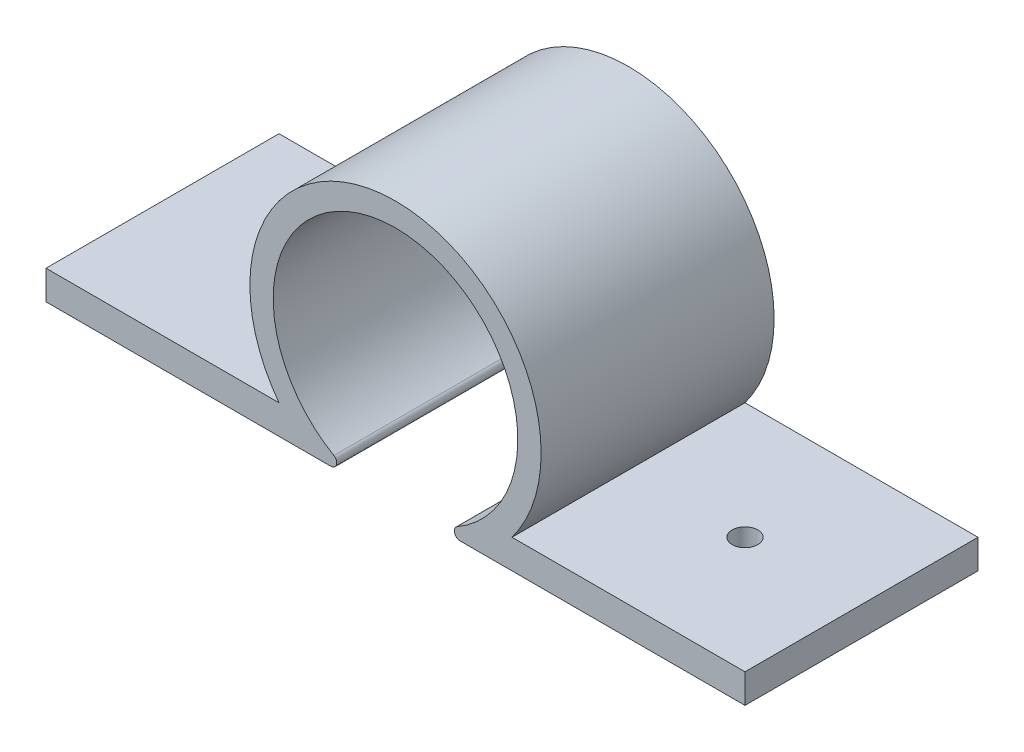
ISO-10303-21;
HEADER;
FILE_DESCRIPTION(('STEP AP214'),'2;1');
FILE_NAME('part.step','',(''),(''),'','','');
FILE_SCHEMA(('AUTOMOTIVE_DESIGN { 1 0 10303 214 1 1 1 1 }'));
ENDSEC;
DATA;
#1=APPLICATION_CONTEXT('core data for automotive mechanical design processes');
#2=APPLICATION_PROTOCOL_DEFINITION('international standard','automotive_design',2000,#1);
#3=PRODUCT_CONTEXT('',#1,'mechanical');
#4=PRODUCT('Part','Part','',(#3));
#5=PRODUCT_RELATED_PRODUCT_CATEGORY('part','',(#4));
#6=PRODUCT_DEFINITION_FORMATION('','',#4);
#7=PRODUCT_DEFINITION_CONTEXT('part definition',#1,'design');
#8=PRODUCT_DEFINITION('design','',#6,#7);
#9=PRODUCT_DEFINITION_SHAPE('','',#8);
#10=(LENGTH_UNIT() NAMED_UNIT(*) SI_UNIT(.MILLI.,.METRE.));
#11=(NAMED_UNIT(*) PLANE_ANGLE_UNIT() SI_UNIT($,.RADIAN.));
#12=(NAMED_UNIT(*) SI_UNIT($,.STERADIAN.) SOLID_ANGLE_UNIT());
#13=UNCERTAINTY_MEASURE_WITH_UNIT(LENGTH_MEASURE(1.E-05),#10,'distance_accuracy_value','');
#14=(GEOMETRIC_REPRESENTATION_CONTEXT(3) GLOBAL_UNCERTAINTY_ASSIGNED_CONTEXT((#13)) GLOBAL_UNIT_ASSIGNED_CONTEXT((#10,
#11,#12)) REPRESENTATION_CONTEXT('',''));
#15=CARTESIAN_POINT('',(0.,0.,0.));
#16=DIRECTION('',(0.,0.,1.));
#17=DIRECTION('',(1.,0.,0.));
#18=AXIS2_PLACEMENT_3D('',#15,#16,#17);
#19=CARTESIAN_POINT('',(-30.,-1.25,20.));
#20=DIRECTION('',(0.,1.,0.));
#21=DIRECTION('',(-1.,0.,0.));
#22=AXIS2_PLACEMENT_3D('',#19,#20,#21);
#23=PLANE('',#22);
#24=CARTESIAN_POINT('',(-20.,-1.25,10.));
#25=DIRECTION('',(0.,1.,0.));
#26=DIRECTION('',(-1.,0.,0.));
#27=AXIS2_PLACEMENT_3D('',#24,#25,#26);
#28=CIRCLE('',#27,1.1);
#29=CARTESIAN_POINT('',(-21.1,-1.25,10.));
#30=VERTEX_POINT('',#29);
#31=EDGE_CURVE('E214',#30,#30,#28,.F.);
#32=ORIENTED_EDGE('',*,*,#31,.F.);
#33=EDGE_LOOP('',(#32));
#34=FACE_BOUND('',#33,.T.);
#35=DIRECTION('',(1.,0.,0.));
#36=VECTOR('',#35,1.);
#37=CARTESIAN_POINT('',(-30.,-1.25,0.));
#38=LINE('',#37,#36);
#39=CARTESIAN_POINT('',(-30.,-1.25,0.));
#40=VERTEX_POINT('',#39);
#41=CARTESIAN_POINT('',(-5.54526825320472,-1.25,0.));
#42=VERTEX_POINT('',#41);
#43=EDGE_CURVE('E132',#40,#42,#38,.T.);
#44=ORIENTED_EDGE('',*,*,#43,.T.);
#45=DIRECTION('',(0.,0.,1.));
#46=VECTOR('',#45,1.);
#47=CARTESIAN_POINT('',(-5.54526825320471,-1.25,20.));
#48=LINE('',#47,#46);
#49=CARTESIAN_POINT('',(-5.54526825320472,-1.25,20.));
#50=VERTEX_POINT('',#49);
#51=EDGE_CURVE('E11',#42,#50,#48,.T.);
#52=ORIENTED_EDGE('',*,*,#51,.T.);
#53=DIRECTION('',(1.,0.,0.));
#54=VECTOR('',#53,1.);
#55=CARTESIAN_POINT('',(-30.,-1.25,20.));
#56=LINE('',#55,#54);
#57=CARTESIAN_POINT('',(-30.,-1.25,20.));
#58=VERTEX_POINT('',#57);
#59=EDGE_CURVE('E165',#58,#50,#56,.T.);
#60=ORIENTED_EDGE('',*,*,#59,.F.);
#61=DIRECTION('',(0.,0.,-1.));
#62=VECTOR('',#61,1.);
#63=CARTESIAN_POINT('',(-30.,-1.25,20.));
#64=LINE('',#63,#62);
#65=EDGE_CURVE('E183',#58,#40,#64,.T.);
#66=ORIENTED_EDGE('',*,*,#65,.T.);
#67=EDGE_LOOP('',(#44,#52,#60,#66));
#68=FACE_BOUND('',#67,.T.);
#69=ADVANCED_FACE('F36',(#34,#68),#23,.F.);
#70=CARTESIAN_POINT('',(30.,1.25,20.));
#71=DIRECTION('',(-1.,0.,0.));
#72=DIRECTION('',(0.,0.,1.));
#73=AXIS2_PLACEMENT_3D('',#70,#71,#72);
#74=PLANE('',#73);
#75=DIRECTION('',(0.,1.,0.));
#76=VECTOR('',#75,1.);
#77=CARTESIAN_POINT('',(30.,1.25,0.));
#78=LINE('',#77,#76);
#79=CARTESIAN_POINT('',(30.,-1.25,0.));
#80=VERTEX_POINT('',#79);
#81=CARTESIAN_POINT('',(30.,1.25,0.));
#82=VERTEX_POINT('',#81);
#83=EDGE_CURVE('E136',#80,#82,#78,.T.);
#84=ORIENTED_EDGE('',*,*,#83,.T.);
#85=DIRECTION('',(0.,0.,-1.));
#86=VECTOR('',#85,1.);
#87=CARTESIAN_POINT('',(30.,1.25,20.));
#88=LINE('',#87,#86);
#89=CARTESIAN_POINT('',(30.,1.25,20.));
#90=VERTEX_POINT('',#89);
#91=EDGE_CURVE('E117',#90,#82,#88,.T.);
#92=ORIENTED_EDGE('',*,*,#91,.F.);
#93=DIRECTION('',(0.,1.,0.));
#94=VECTOR('',#93,1.);
#95=CARTESIAN_POINT('',(30.,1.25,20.));
#96=LINE('',#95,#94);
#97=CARTESIAN_POINT('',(30.,-1.25,20.));
#98=VERTEX_POINT('',#97);
#99=EDGE_CURVE('E123',#98,#90,#96,.T.);
#100=ORIENTED_EDGE('',*,*,#99,.F.);
#101=DIRECTION('',(0.,0.,-1.));
#102=VECTOR('',#101,1.);
#103=CARTESIAN_POINT('',(30.,-1.25,20.));
#104=LINE('',#103,#102);
#105=EDGE_CURVE('E164',#98,#80,#104,.T.);
#106=ORIENTED_EDGE('',*,*,#105,.T.);
#107=EDGE_LOOP('',(#84,#92,#100,#106));
#108=FACE_BOUND('',#107,.T.);
#109=ADVANCED_FACE('F134',(#108),#74,.F.);
#110=CARTESIAN_POINT('',(10.,1.25000000000001,20.));
#111=DIRECTION('',(0.,-1.,0.));
#112=DIRECTION('',(1.,0.,0.));
#113=AXIS2_PLACEMENT_3D('',#110,#111,#112);
#114=PLANE('',#113);
#115=CARTESIAN_POINT('',(20.,1.25000000000001,10.));
#116=DIRECTION('',(0.,1.,0.));
#117=DIRECTION('',(0.,0.,1.));
#118=AXIS2_PLACEMENT_3D('',#115,#116,#117);
#119=CIRCLE('',#118,1.1);
#120=CARTESIAN_POINT('',(20.,1.25000000000001,11.1));
#121=VERTEX_POINT('',#120);
#122=EDGE_CURVE('E219',#121,#121,#119,.T.);
#123=ORIENTED_EDGE('',*,*,#122,.F.);
#124=EDGE_LOOP('',(#123));
#125=FACE_BOUND('',#124,.T.);
#126=DIRECTION('',(-1.,0.,0.));
#127=VECTOR('',#126,1.);
#128=CARTESIAN_POINT('',(10.,1.25000000000001,0.));
#129=LINE('',#128,#127);
#130=CARTESIAN_POINT('',(10.,1.25000000000001,0.));
#131=VERTEX_POINT('',#130);
#132=EDGE_CURVE('E205',#82,#131,#129,.T.);
#133=ORIENTED_EDGE('',*,*,#132,.T.);
#134=DIRECTION('',(0.,0.,-1.));
#135=VECTOR('',#134,1.);
#136=CARTESIAN_POINT('',(10.,1.25000000000001,20.));
#137=LINE('',#136,#135);
#138=CARTESIAN_POINT('',(10.,1.25000000000001,20.));
#139=VERTEX_POINT('',#138);
#140=EDGE_CURVE('E120',#139,#131,#137,.T.);
#141=ORIENTED_EDGE('',*,*,#140,.F.);
#142=DIRECTION('',(-1.,0.,0.));
#143=VECTOR('',#142,1.);
#144=CARTESIAN_POINT('',(10.,1.25000000000001,20.));
#145=LINE('',#144,#143);
#146=EDGE_CURVE('E113',#90,#139,#145,.T.);
#147=ORIENTED_EDGE('',*,*,#146,.F.);
#148=ORIENTED_EDGE('',*,*,#91,.T.);
#149=EDGE_LOOP('',(#133,#141,#147,#148));
#150=FACE_BOUND('',#149,.T.);
#151=ADVANCED_FACE('F115',(#125,#150),#114,.F.);
#152=CARTESIAN_POINT('',(0.,8.75,20.));
#153=DIRECTION('',(0.,0.,-1.));
#154=DIRECTION('',(-1.,0.,0.));
#155=AXIS2_PLACEMENT_3D('',#152,#153,#154);
#156=CYLINDRICAL_SURFACE('',#155,12.5);
#157=CARTESIAN_POINT('',(0.,8.75,0.));
#158=DIRECTION('',(0.,0.,1.));
#159=DIRECTION('',(1.,0.,0.));
#160=AXIS2_PLACEMENT_3D('',#157,#158,#159);
#161=CIRCLE('',#160,12.5);
#162=CARTESIAN_POINT('',(-10.,1.25000000000001,0.));
#163=VERTEX_POINT('',#162);
#164=EDGE_CURVE('E204',#131,#163,#161,.T.);
#165=ORIENTED_EDGE('',*,*,#164,.T.);
#166=DIRECTION('',(0.,0.,-1.));
#167=VECTOR('',#166,1.);
#168=CARTESIAN_POINT('',(-10.,1.25000000000001,20.));
#169=LINE('',#168,#167);
#170=CARTESIAN_POINT('',(-10.,1.25000000000001,20.));
#171=VERTEX_POINT('',#170);
#172=EDGE_CURVE('E142',#171,#163,#169,.T.);
#173=ORIENTED_EDGE('',*,*,#172,.F.);
#174=CARTESIAN_POINT('',(0.,8.75,20.));
#175=DIRECTION('',(0.,0.,1.));
#176=DIRECTION('',(1.,0.,0.));
#177=AXIS2_PLACEMENT_3D('',#174,#175,#176);
#178=CIRCLE('',#177,12.5);
#179=EDGE_CURVE('E122',#139,#171,#178,.T.);
#180=ORIENTED_EDGE('',*,*,#179,.F.);
#181=ORIENTED_EDGE('',*,*,#140,.T.);
#182=EDGE_LOOP('',(#165,#173,#180,#181));
#183=FACE_BOUND('',#182,.T.);
#184=ADVANCED_FACE('F231',(#183),#156,.T.);
#185=CARTESIAN_POINT('',(-30.,1.25,20.));
#186=DIRECTION('',(0.,-1.,0.));
#187=DIRECTION('',(1.,0.,0.));
#188=AXIS2_PLACEMENT_3D('',#185,#186,#187);
#189=PLANE('',#188);
#190=CARTESIAN_POINT('',(-20.,1.25000000000001,10.));
#191=DIRECTION('',(0.,1.,0.));
#192=DIRECTION('',(0.,0.,1.));
#193=AXIS2_PLACEMENT_3D('',#190,#191,#192);
#194=CIRCLE('',#193,1.1);
#195=CARTESIAN_POINT('',(-20.,1.25000000000001,11.1));
#196=VERTEX_POINT('',#195);
#197=EDGE_CURVE('E218',#196,#196,#194,.T.);
#198=ORIENTED_EDGE('',*,*,#197,.F.);
#199=EDGE_LOOP('',(#198));
#200=FACE_BOUND('',#199,.T.);
#201=DIRECTION('',(-1.,0.,0.));
#202=VECTOR('',#201,1.);
#203=CARTESIAN_POINT('',(-30.,1.25,0.));
#204=LINE('',#203,#202);
#205=CARTESIAN_POINT('',(-30.,1.25,0.));
#206=VERTEX_POINT('',#205);
#207=EDGE_CURVE('E200',#163,#206,#204,.T.);
#208=ORIENTED_EDGE('',*,*,#207,.T.);
#209=DIRECTION('',(0.,0.,-1.));
#210=VECTOR('',#209,1.);
#211=CARTESIAN_POINT('',(-30.,1.25,20.));
#212=LINE('',#211,#210);
#213=CARTESIAN_POINT('',(-30.,1.25,20.));
#214=VERTEX_POINT('',#213);
#215=EDGE_CURVE('E191',#214,#206,#212,.T.);
#216=ORIENTED_EDGE('',*,*,#215,.F.);
#217=DIRECTION('',(-1.,0.,0.));
#218=VECTOR('',#217,1.);
#219=CARTESIAN_POINT('',(-30.,1.25,20.));
#220=LINE('',#219,#218);
#221=EDGE_CURVE('E201',#171,#214,#220,.T.);
#222=ORIENTED_EDGE('',*,*,#221,.F.);
#223=ORIENTED_EDGE('',*,*,#172,.T.);
#224=EDGE_LOOP('',(#208,#216,#222,#223));
#225=FACE_BOUND('',#224,.T.);
#226=ADVANCED_FACE('F198',(#200,#225),#189,.F.);
#227=CARTESIAN_POINT('',(-30.,1.25,20.));
#228=DIRECTION('',(1.,0.,0.));
#229=DIRECTION('',(0.,0.,-1.));
#230=AXIS2_PLACEMENT_3D('',#227,#228,#229);
#231=PLANE('',#230);
#232=DIRECTION('',(0.,-1.,0.));
#233=VECTOR('',#232,1.);
#234=CARTESIAN_POINT('',(-30.,1.25,0.));
#235=LINE('',#234,#233);
#236=EDGE_CURVE('E185',#206,#40,#235,.T.);
#237=ORIENTED_EDGE('',*,*,#236,.T.);
#238=ORIENTED_EDGE('',*,*,#65,.F.);
#239=DIRECTION('',(0.,-1.,0.));
#240=VECTOR('',#239,1.);
#241=CARTESIAN_POINT('',(-30.,1.25,20.));
#242=LINE('',#241,#240);
#243=EDGE_CURVE('E166',#214,#58,#242,.T.);
#244=ORIENTED_EDGE('',*,*,#243,.F.);
#245=ORIENTED_EDGE('',*,*,#215,.T.);
#246=EDGE_LOOP('',(#237,#238,#244,#245));
#247=FACE_BOUND('',#246,.T.);
#248=ADVANCED_FACE('F230',(#247),#231,.F.);
#249=CARTESIAN_POINT('',(20.,-1.25,10.));
#250=DIRECTION('',(0.,1.,0.));
#251=DIRECTION('',(-1.,0.,0.));
#252=AXIS2_PLACEMENT_3D('',#249,#250,#251);
#253=CIRCLE('',#252,1.1);
#254=CARTESIAN_POINT('',(18.9,-1.25,10.));
#255=VERTEX_POINT('',#254);
#256=EDGE_CURVE('E215',#255,#255,#253,.F.);
#257=ORIENTED_EDGE('',*,*,#256,.F.);
#258=EDGE_LOOP('',(#257));
#259=FACE_BOUND('',#258,.T.);
#260=CARTESIAN_POINT('',(5.5452682532047,-1.25,20.));
#261=VERTEX_POINT('',#260);
#262=EDGE_CURVE('E128',#261,#98,#56,.T.);
#263=ORIENTED_EDGE('',*,*,#262,.F.);
#264=DIRECTION('',(0.,0.,1.));
#265=VECTOR('',#264,1.);
#266=CARTESIAN_POINT('',(5.54526825320471,-1.25,20.));
#267=LINE('',#266,#265);
#268=CARTESIAN_POINT('',(5.5452682532047,-1.25,0.));
#269=VERTEX_POINT('',#268);
#270=EDGE_CURVE('E140',#261,#269,#267,.F.);
#271=ORIENTED_EDGE('',*,*,#270,.T.);
#272=EDGE_CURVE('E173',#269,#80,#38,.T.);
#273=ORIENTED_EDGE('',*,*,#272,.T.);
#274=ORIENTED_EDGE('',*,*,#105,.F.);
#275=EDGE_LOOP('',(#263,#271,#273,#274));
#276=FACE_BOUND('',#275,.T.);
#277=ADVANCED_FACE('F162',(#259,#276),#23,.F.);
#278=CARTESIAN_POINT('',(0.,8.75,20.));
#279=DIRECTION('',(0.,0.,1.));
#280=DIRECTION('',(1.,0.,0.));
#281=AXIS2_PLACEMENT_3D('',#278,#279,#280);
#282=PLANE('',#281);
#283=CARTESIAN_POINT('',(0.,8.75,20.));
#284=DIRECTION('',(0.,0.,1.));
#285=DIRECTION('',(1.,0.,0.));
#286=AXIS2_PLACEMENT_3D('',#283,#284,#285);
#287=CIRCLE('',#286,10.5);
#288=CARTESIAN_POINT('',(5.29321060533177,-0.318181818181818,20.));
#289=VERTEX_POINT('',#288);
#290=CARTESIAN_POINT('',(-5.29321060533177,-0.318181818181818,20.));
#291=VERTEX_POINT('',#290);
#292=EDGE_CURVE('E157',#289,#291,#287,.T.);
#293=ORIENTED_EDGE('',*,*,#292,.F.);
#294=CARTESIAN_POINT('',(5.54526825320471,-0.750000000000001,20.));
#295=DIRECTION('',(0.,0.,1.));
#296=DIRECTION('',(1.,0.,0.));
#297=AXIS2_PLACEMENT_3D('',#294,#295,#296);
#298=CIRCLE('',#297,0.5);
#299=EDGE_CURVE('E44',#289,#261,#298,.T.);
#300=ORIENTED_EDGE('',*,*,#299,.T.);
#301=ORIENTED_EDGE('',*,*,#262,.T.);
#302=ORIENTED_EDGE('',*,*,#99,.T.);
#303=ORIENTED_EDGE('',*,*,#146,.T.);
#304=ORIENTED_EDGE('',*,*,#179,.T.);
#305=ORIENTED_EDGE('',*,*,#221,.T.);
#306=ORIENTED_EDGE('',*,*,#243,.T.);
#307=ORIENTED_EDGE('',*,*,#59,.T.);
#308=CARTESIAN_POINT('',(-5.54526825320471,-0.750000000000001,20.));
#309=DIRECTION('',(0.,0.,1.));
#310=DIRECTION('',(1.,0.,0.));
#311=AXIS2_PLACEMENT_3D('',#308,#309,#310);
#312=CIRCLE('',#311,0.5);
#313=EDGE_CURVE('E51',#50,#291,#312,.T.);
#314=ORIENTED_EDGE('',*,*,#313,.T.);
#315=EDGE_LOOP('',(#293,#300,#301,#302,#303,#304,#305,#306,#307,#314));
#316=FACE_BOUND('',#315,.T.);
#317=ADVANCED_FACE('F126',(#316),#282,.T.);
#318=CARTESIAN_POINT('',(0.,8.75,0.));
#319=DIRECTION('',(0.,0.,1.));
#320=DIRECTION('',(1.,0.,0.));
#321=AXIS2_PLACEMENT_3D('',#318,#319,#320);
#322=PLANE('',#321);
#323=ORIENTED_EDGE('',*,*,#272,.F.);
#324=CARTESIAN_POINT('',(5.54526825320471,-0.750000000000001,0.));
#325=DIRECTION('',(0.,0.,1.));
#326=DIRECTION('',(1.,0.,0.));
#327=AXIS2_PLACEMENT_3D('',#324,#325,#326);
#328=CIRCLE('',#327,0.5);
#329=CARTESIAN_POINT('',(5.29321060533177,-0.318181818181818,0.));
#330=VERTEX_POINT('',#329);
#331=EDGE_CURVE('E150',#269,#330,#328,.F.);
#332=ORIENTED_EDGE('',*,*,#331,.T.);
#333=CARTESIAN_POINT('',(0.,8.75,0.));
#334=DIRECTION('',(0.,0.,1.));
#335=DIRECTION('',(1.,0.,0.));
#336=AXIS2_PLACEMENT_3D('',#333,#334,#335);
#337=CIRCLE('',#336,10.5);
#338=CARTESIAN_POINT('',(-5.29321060533177,-0.318181818181818,0.));
#339=VERTEX_POINT('',#338);
#340=EDGE_CURVE('E137',#330,#339,#337,.T.);
#341=ORIENTED_EDGE('',*,*,#340,.T.);
#342=CARTESIAN_POINT('',(-5.54526825320471,-0.750000000000001,0.));
#343=DIRECTION('',(0.,0.,1.));
#344=DIRECTION('',(1.,0.,0.));
#345=AXIS2_PLACEMENT_3D('',#342,#343,#344);
#346=CIRCLE('',#345,0.5);
#347=EDGE_CURVE('E148',#339,#42,#346,.F.);
#348=ORIENTED_EDGE('',*,*,#347,.T.);
#349=ORIENTED_EDGE('',*,*,#43,.F.);
#350=ORIENTED_EDGE('',*,*,#236,.F.);
#351=ORIENTED_EDGE('',*,*,#207,.F.);
#352=ORIENTED_EDGE('',*,*,#164,.F.);
#353=ORIENTED_EDGE('',*,*,#132,.F.);
#354=ORIENTED_EDGE('',*,*,#83,.F.);
#355=EDGE_LOOP('',(#323,#332,#341,#348,#349,#350,#351,#352,#353,#354));
#356=FACE_BOUND('',#355,.T.);
#357=ADVANCED_FACE('F171',(#356),#322,.F.);
#358=CARTESIAN_POINT('',(0.,8.75,0.));
#359=DIRECTION('',(0.,0.,1.));
#360=DIRECTION('',(1.,0.,0.));
#361=AXIS2_PLACEMENT_3D('',#358,#359,#360);
#362=CYLINDRICAL_SURFACE('',#361,10.5);
#363=ORIENTED_EDGE('',*,*,#340,.F.);
#364=DIRECTION('',(0.,0.,1.));
#365=VECTOR('',#364,1.);
#366=CARTESIAN_POINT('',(5.29321060533177,-0.318181818181818,0.));
#367=LINE('',#366,#365);
#368=EDGE_CURVE('E154',#330,#289,#367,.T.);
#369=ORIENTED_EDGE('',*,*,#368,.T.);
#370=ORIENTED_EDGE('',*,*,#292,.T.);
#371=DIRECTION('',(0.,0.,1.));
#372=VECTOR('',#371,1.);
#373=CARTESIAN_POINT('',(-5.29321060533177,-0.318181818181818,0.));
#374=LINE('',#373,#372);
#375=EDGE_CURVE('E152',#291,#339,#374,.F.);
#376=ORIENTED_EDGE('',*,*,#375,.T.);
#377=EDGE_LOOP('',(#363,#369,#370,#376));
#378=FACE_BOUND('',#377,.T.);
#379=ADVANCED_FACE('F175',(#378),#362,.F.);
#380=CARTESIAN_POINT('',(20.,-4.36126983722081,10.));
#381=DIRECTION('',(0.,1.,0.));
#382=DIRECTION('',(0.,0.,1.));
#383=AXIS2_PLACEMENT_3D('',#380,#381,#382);
#384=CYLINDRICAL_SURFACE('',#383,1.1);
#385=ORIENTED_EDGE('',*,*,#256,.T.);
#386=EDGE_LOOP('',(#385));
#387=FACE_BOUND('',#386,.T.);
#388=ORIENTED_EDGE('',*,*,#122,.T.);
#389=EDGE_LOOP('',(#388));
#390=FACE_BOUND('',#389,.T.);
#391=ADVANCED_FACE('F257',(#387,#390),#384,.F.);
#392=CARTESIAN_POINT('',(-20.,-4.36126983722081,10.));
#393=DIRECTION('',(0.,1.,0.));
#394=DIRECTION('',(0.,0.,1.));
#395=AXIS2_PLACEMENT_3D('',#392,#393,#394);
#396=CYLINDRICAL_SURFACE('',#395,1.1);
#397=ORIENTED_EDGE('',*,*,#31,.T.);
#398=EDGE_LOOP('',(#397));
#399=FACE_BOUND('',#398,.T.);
#400=ORIENTED_EDGE('',*,*,#197,.T.);
#401=EDGE_LOOP('',(#400));
#402=FACE_BOUND('',#401,.T.);
#403=ADVANCED_FACE('F227',(#399,#402),#396,.F.);
#404=CARTESIAN_POINT('',(5.54526825320471,-0.750000000000001,0.));
#405=DIRECTION('',(0.,0.,1.));
#406=DIRECTION('',(1.,0.,0.));
#407=AXIS2_PLACEMENT_3D('',#404,#405,#406);
#408=CYLINDRICAL_SURFACE('',#407,0.5);
#409=ORIENTED_EDGE('',*,*,#299,.F.);
#410=ORIENTED_EDGE('',*,*,#368,.F.);
#411=ORIENTED_EDGE('',*,*,#331,.F.);
#412=ORIENTED_EDGE('',*,*,#270,.F.);
#413=EDGE_LOOP('',(#409,#410,#411,#412));
#414=FACE_BOUND('',#413,.T.);
#415=ADVANCED_FACE('F168',(#414),#408,.T.);
#416=CARTESIAN_POINT('',(-5.54526825320471,-0.750000000000001,0.));
#417=DIRECTION('',(0.,0.,1.));
#418=DIRECTION('',(1.,0.,0.));
#419=AXIS2_PLACEMENT_3D('',#416,#417,#418);
#420=CYLINDRICAL_SURFACE('',#419,0.5);
#421=ORIENTED_EDGE('',*,*,#347,.F.);
#422=ORIENTED_EDGE('',*,*,#375,.F.);
#423=ORIENTED_EDGE('',*,*,#313,.F.);
#424=ORIENTED_EDGE('',*,*,#51,.F.);
#425=EDGE_LOOP('',(#421,#422,#423,#424));
#426=FACE_BOUND('',#425,.T.);
#427=ADVANCED_FACE('F38',(#426),#420,.T.);
#428=CLOSED_SHELL('',(#69,#109,#151,#184,#226,#248,#277,#317,#357,#379,#391,#403,#415,#427));
#429=MANIFOLD_SOLID_BREP('B2',#428);
#430=ADVANCED_BREP_SHAPE_REPRESENTATION('',(#18,#429),#14);
#431=SHAPE_DEFINITION_REPRESENTATION(#9,#430);
ENDSEC;
END-ISO-10303-21;
